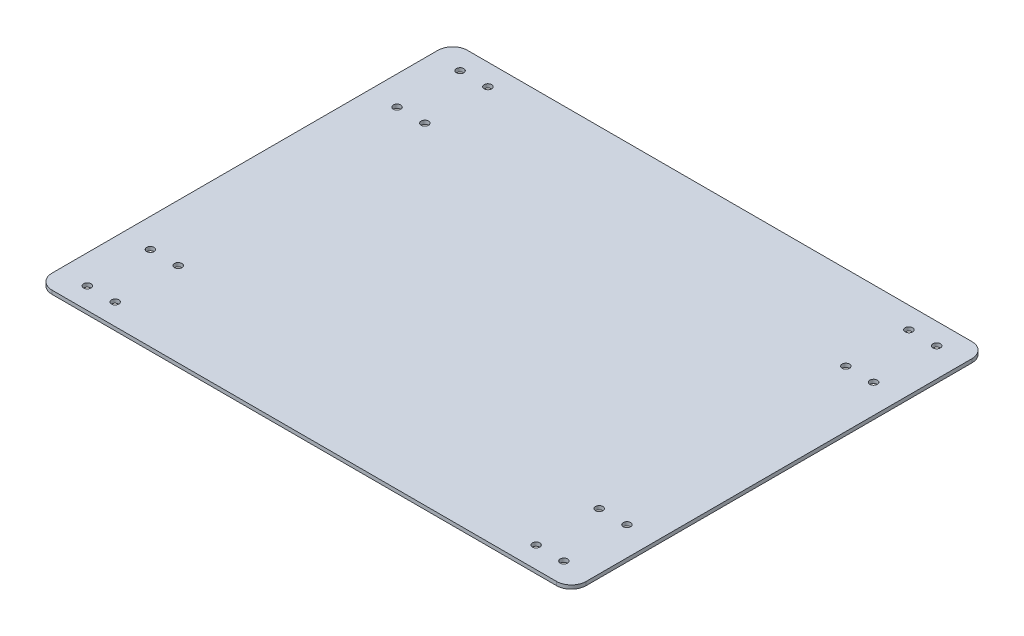
ISO-10303-21;
HEADER;
FILE_DESCRIPTION(('STEP AP214'),'2;1');
FILE_NAME('part.step','',(''),(''),'','','');
FILE_SCHEMA(('AUTOMOTIVE_DESIGN { 1 0 10303 214 1 1 1 1 }'));
ENDSEC;
DATA;
#1=APPLICATION_CONTEXT('core data for automotive mechanical design processes');
#2=APPLICATION_PROTOCOL_DEFINITION('international standard','automotive_design',2000,#1);
#3=PRODUCT_CONTEXT('',#1,'mechanical');
#4=PRODUCT('Part','Part','',(#3));
#5=PRODUCT_RELATED_PRODUCT_CATEGORY('part','',(#4));
#6=PRODUCT_DEFINITION_FORMATION('','',#4);
#7=PRODUCT_DEFINITION_CONTEXT('part definition',#1,'design');
#8=PRODUCT_DEFINITION('design','',#6,#7);
#9=PRODUCT_DEFINITION_SHAPE('','',#8);
#10=(LENGTH_UNIT() NAMED_UNIT(*) SI_UNIT(.MILLI.,.METRE.));
#11=(NAMED_UNIT(*) PLANE_ANGLE_UNIT() SI_UNIT($,.RADIAN.));
#12=(NAMED_UNIT(*) SI_UNIT($,.STERADIAN.) SOLID_ANGLE_UNIT());
#13=UNCERTAINTY_MEASURE_WITH_UNIT(LENGTH_MEASURE(1.E-05),#10,'distance_accuracy_value','');
#14=(GEOMETRIC_REPRESENTATION_CONTEXT(3) GLOBAL_UNCERTAINTY_ASSIGNED_CONTEXT((#13)) GLOBAL_UNIT_ASSIGNED_CONTEXT((#10,
#11,#12)) REPRESENTATION_CONTEXT('',''));
#15=CARTESIAN_POINT('',(0.,0.,0.));
#16=DIRECTION('',(0.,0.,1.));
#17=DIRECTION('',(1.,0.,0.));
#18=AXIS2_PLACEMENT_3D('',#15,#16,#17);
#19=CARTESIAN_POINT('',(-228.6,3.175,177.8));
#20=DIRECTION('',(-1.,0.,0.));
#21=DIRECTION('',(0.,0.,1.));
#22=AXIS2_PLACEMENT_3D('',#19,#20,#21);
#23=PLANE('',#22);
#24=DIRECTION('',(0.,0.,-1.));
#25=VECTOR('',#24,1.);
#26=CARTESIAN_POINT('',(-228.6,3.175,177.8));
#27=LINE('',#26,#25);
#28=CARTESIAN_POINT('',(-228.6,3.175,165.1));
#29=VERTEX_POINT('',#28);
#30=CARTESIAN_POINT('',(-228.6,3.175,-165.1));
#31=VERTEX_POINT('',#30);
#32=EDGE_CURVE('E168',#29,#31,#27,.T.);
#33=ORIENTED_EDGE('',*,*,#32,.T.);
#34=DIRECTION('',(0.,-1.,0.));
#35=VECTOR('',#34,1.);
#36=CARTESIAN_POINT('',(-228.6,3.175,-165.1));
#37=LINE('',#36,#35);
#38=CARTESIAN_POINT('',(-228.6,0.,-165.1));
#39=VERTEX_POINT('',#38);
#40=EDGE_CURVE('E115',#31,#39,#37,.T.);
#41=ORIENTED_EDGE('',*,*,#40,.T.);
#42=DIRECTION('',(0.,0.,-1.));
#43=VECTOR('',#42,1.);
#44=CARTESIAN_POINT('',(-228.6,0.,177.8));
#45=LINE('',#44,#43);
#46=CARTESIAN_POINT('',(-228.6,0.,165.1));
#47=VERTEX_POINT('',#46);
#48=EDGE_CURVE('E107',#47,#39,#45,.T.);
#49=ORIENTED_EDGE('',*,*,#48,.F.);
#50=DIRECTION('',(0.,-1.,0.));
#51=VECTOR('',#50,1.);
#52=CARTESIAN_POINT('',(-228.6,3.175,165.1));
#53=LINE('',#52,#51);
#54=EDGE_CURVE('E120',#47,#29,#53,.F.);
#55=ORIENTED_EDGE('',*,*,#54,.T.);
#56=EDGE_LOOP('',(#33,#41,#49,#55));
#57=FACE_BOUND('',#56,.T.);
#58=ADVANCED_FACE('F38',(#57),#23,.T.);
#59=CARTESIAN_POINT('',(-228.6,3.175,177.8));
#60=DIRECTION('',(0.,0.,-1.));
#61=DIRECTION('',(-1.,0.,0.));
#62=AXIS2_PLACEMENT_3D('',#59,#60,#61);
#63=PLANE('',#62);
#64=DIRECTION('',(1.,0.,0.));
#65=VECTOR('',#64,1.);
#66=CARTESIAN_POINT('',(-228.6,0.,177.8));
#67=LINE('',#66,#65);
#68=CARTESIAN_POINT('',(-215.9,0.,177.8));
#69=VERTEX_POINT('',#68);
#70=CARTESIAN_POINT('',(215.9,0.,177.8));
#71=VERTEX_POINT('',#70);
#72=EDGE_CURVE('E109',#69,#71,#67,.T.);
#73=ORIENTED_EDGE('',*,*,#72,.T.);
#74=DIRECTION('',(0.,-1.,0.));
#75=VECTOR('',#74,1.);
#76=CARTESIAN_POINT('',(215.9,3.175,177.8));
#77=LINE('',#76,#75);
#78=CARTESIAN_POINT('',(215.9,3.175,177.8));
#79=VERTEX_POINT('',#78);
#80=EDGE_CURVE('E11',#71,#79,#77,.F.);
#81=ORIENTED_EDGE('',*,*,#80,.T.);
#82=DIRECTION('',(1.,0.,0.));
#83=VECTOR('',#82,1.);
#84=CARTESIAN_POINT('',(-228.6,3.175,177.8));
#85=LINE('',#84,#83);
#86=CARTESIAN_POINT('',(-215.9,3.175,177.8));
#87=VERTEX_POINT('',#86);
#88=EDGE_CURVE('E128',#87,#79,#85,.T.);
#89=ORIENTED_EDGE('',*,*,#88,.F.);
#90=DIRECTION('',(0.,-1.,0.));
#91=VECTOR('',#90,1.);
#92=CARTESIAN_POINT('',(-215.9,0.,177.8));
#93=LINE('',#92,#91);
#94=EDGE_CURVE('E46',#87,#69,#93,.T.);
#95=ORIENTED_EDGE('',*,*,#94,.T.);
#96=EDGE_LOOP('',(#73,#81,#89,#95));
#97=FACE_BOUND('',#96,.T.);
#98=ADVANCED_FACE('F157',(#97),#63,.F.);
#99=CARTESIAN_POINT('',(228.6,3.175,177.8));
#100=DIRECTION('',(-1.,0.,0.));
#101=DIRECTION('',(0.,0.,1.));
#102=AXIS2_PLACEMENT_3D('',#99,#100,#101);
#103=PLANE('',#102);
#104=DIRECTION('',(0.,0.,-1.));
#105=VECTOR('',#104,1.);
#106=CARTESIAN_POINT('',(228.6,0.,177.8));
#107=LINE('',#106,#105);
#108=CARTESIAN_POINT('',(228.6,0.,165.1));
#109=VERTEX_POINT('',#108);
#110=CARTESIAN_POINT('',(228.6,0.,-165.1));
#111=VERTEX_POINT('',#110);
#112=EDGE_CURVE('E166',#109,#111,#107,.T.);
#113=ORIENTED_EDGE('',*,*,#112,.T.);
#114=DIRECTION('',(0.,-1.,0.));
#115=VECTOR('',#114,1.);
#116=CARTESIAN_POINT('',(228.6,3.175,-165.1));
#117=LINE('',#116,#115);
#118=CARTESIAN_POINT('',(228.6,3.175,-165.1));
#119=VERTEX_POINT('',#118);
#120=EDGE_CURVE('E53',#111,#119,#117,.F.);
#121=ORIENTED_EDGE('',*,*,#120,.T.);
#122=DIRECTION('',(0.,0.,-1.));
#123=VECTOR('',#122,1.);
#124=CARTESIAN_POINT('',(228.6,3.175,177.8));
#125=LINE('',#124,#123);
#126=CARTESIAN_POINT('',(228.6,3.175,165.1));
#127=VERTEX_POINT('',#126);
#128=EDGE_CURVE('E131',#127,#119,#125,.T.);
#129=ORIENTED_EDGE('',*,*,#128,.F.);
#130=DIRECTION('',(0.,-1.,0.));
#131=VECTOR('',#130,1.);
#132=CARTESIAN_POINT('',(228.6,3.175,165.1));
#133=LINE('',#132,#131);
#134=EDGE_CURVE('E152',#127,#109,#133,.T.);
#135=ORIENTED_EDGE('',*,*,#134,.T.);
#136=EDGE_LOOP('',(#113,#121,#129,#135));
#137=FACE_BOUND('',#136,.T.);
#138=ADVANCED_FACE('F165',(#137),#103,.F.);
#139=CARTESIAN_POINT('',(-228.6,3.175,-177.8));
#140=DIRECTION('',(0.,0.,-1.));
#141=DIRECTION('',(-1.,0.,0.));
#142=AXIS2_PLACEMENT_3D('',#139,#140,#141);
#143=PLANE('',#142);
#144=DIRECTION('',(1.,0.,0.));
#145=VECTOR('',#144,1.);
#146=CARTESIAN_POINT('',(-228.6,0.,-177.8));
#147=LINE('',#146,#145);
#148=CARTESIAN_POINT('',(-215.9,0.,-177.8));
#149=VERTEX_POINT('',#148);
#150=CARTESIAN_POINT('',(215.9,0.,-177.8));
#151=VERTEX_POINT('',#150);
#152=EDGE_CURVE('E123',#149,#151,#147,.T.);
#153=ORIENTED_EDGE('',*,*,#152,.F.);
#154=DIRECTION('',(0.,-1.,0.));
#155=VECTOR('',#154,1.);
#156=CARTESIAN_POINT('',(-215.9,3.175,-177.8));
#157=LINE('',#156,#155);
#158=CARTESIAN_POINT('',(-215.9,3.175,-177.8));
#159=VERTEX_POINT('',#158);
#160=EDGE_CURVE('E144',#149,#159,#157,.F.);
#161=ORIENTED_EDGE('',*,*,#160,.T.);
#162=DIRECTION('',(1.,0.,0.));
#163=VECTOR('',#162,1.);
#164=CARTESIAN_POINT('',(-228.6,3.175,-177.8));
#165=LINE('',#164,#163);
#166=CARTESIAN_POINT('',(215.9,3.175,-177.8));
#167=VERTEX_POINT('',#166);
#168=EDGE_CURVE('E172',#159,#167,#165,.T.);
#169=ORIENTED_EDGE('',*,*,#168,.T.);
#170=DIRECTION('',(0.,-1.,0.));
#171=VECTOR('',#170,1.);
#172=CARTESIAN_POINT('',(215.9,0.,-177.8));
#173=LINE('',#172,#171);
#174=EDGE_CURVE('E141',#167,#151,#173,.T.);
#175=ORIENTED_EDGE('',*,*,#174,.T.);
#176=EDGE_LOOP('',(#153,#161,#169,#175));
#177=FACE_BOUND('',#176,.T.);
#178=ADVANCED_FACE('F336',(#177),#143,.T.);
#179=CARTESIAN_POINT('',(0.,3.175,0.));
#180=DIRECTION('',(0.,-1.,0.));
#181=DIRECTION('',(0.,0.,-1.));
#182=AXIS2_PLACEMENT_3D('',#179,#180,#181);
#183=PLANE('',#182);
#184=CARTESIAN_POINT('',(-180.18125,3.175,105.56875));
#185=DIRECTION('',(0.,-1.,0.));
#186=DIRECTION('',(0.,0.,1.));
#187=AXIS2_PLACEMENT_3D('',#184,#185,#186);
#188=CIRCLE('',#187,3.175);
#189=CARTESIAN_POINT('',(-180.18125,3.175,108.74375));
#190=VERTEX_POINT('',#189);
#191=EDGE_CURVE('E251',#190,#190,#188,.T.);
#192=ORIENTED_EDGE('',*,*,#191,.T.);
#193=EDGE_LOOP('',(#192));
#194=FACE_BOUND('',#193,.T.);
#195=CARTESIAN_POINT('',(-203.99375,3.175,159.54375));
#196=DIRECTION('',(0.,-1.,0.));
#197=DIRECTION('',(0.,0.,1.));
#198=AXIS2_PLACEMENT_3D('',#195,#196,#197);
#199=CIRCLE('',#198,3.17499999999997);
#200=CARTESIAN_POINT('',(-203.99375,3.175,162.71875));
#201=VERTEX_POINT('',#200);
#202=EDGE_CURVE('E257',#201,#201,#199,.T.);
#203=ORIENTED_EDGE('',*,*,#202,.T.);
#204=EDGE_LOOP('',(#203));
#205=FACE_BOUND('',#204,.T.);
#206=CARTESIAN_POINT('',(-203.99375,3.175,105.56875));
#207=DIRECTION('',(0.,-1.,0.));
#208=DIRECTION('',(0.,0.,1.));
#209=AXIS2_PLACEMENT_3D('',#206,#207,#208);
#210=CIRCLE('',#209,3.17499999999997);
#211=CARTESIAN_POINT('',(-203.99375,3.175,108.74375));
#212=VERTEX_POINT('',#211);
#213=EDGE_CURVE('E258',#212,#212,#210,.T.);
#214=ORIENTED_EDGE('',*,*,#213,.T.);
#215=EDGE_LOOP('',(#214));
#216=FACE_BOUND('',#215,.T.);
#217=CARTESIAN_POINT('',(-180.18125,3.175,159.54375));
#218=DIRECTION('',(0.,-1.,0.));
#219=DIRECTION('',(0.,0.,1.));
#220=AXIS2_PLACEMENT_3D('',#217,#218,#219);
#221=CIRCLE('',#220,3.175);
#222=CARTESIAN_POINT('',(-180.18125,3.175,162.71875));
#223=VERTEX_POINT('',#222);
#224=EDGE_CURVE('E245',#223,#223,#221,.T.);
#225=ORIENTED_EDGE('',*,*,#224,.T.);
#226=EDGE_LOOP('',(#225));
#227=FACE_BOUND('',#226,.T.);
#228=CARTESIAN_POINT('',(-180.18125,3.175,-105.56875));
#229=DIRECTION('',(0.,1.,0.));
#230=DIRECTION('',(0.,0.,-1.));
#231=AXIS2_PLACEMENT_3D('',#228,#229,#230);
#232=CIRCLE('',#231,3.175);
#233=CARTESIAN_POINT('',(-180.18125,3.175,-108.74375));
#234=VERTEX_POINT('',#233);
#235=EDGE_CURVE('E227',#234,#234,#232,.T.);
#236=ORIENTED_EDGE('',*,*,#235,.F.);
#237=EDGE_LOOP('',(#236));
#238=FACE_BOUND('',#237,.T.);
#239=CARTESIAN_POINT('',(-203.99375,3.175,-159.54375));
#240=DIRECTION('',(0.,1.,0.));
#241=DIRECTION('',(0.,0.,-1.));
#242=AXIS2_PLACEMENT_3D('',#239,#240,#241);
#243=CIRCLE('',#242,3.17499999999997);
#244=CARTESIAN_POINT('',(-203.99375,3.175,-162.71875));
#245=VERTEX_POINT('',#244);
#246=EDGE_CURVE('E233',#245,#245,#243,.T.);
#247=ORIENTED_EDGE('',*,*,#246,.F.);
#248=EDGE_LOOP('',(#247));
#249=FACE_BOUND('',#248,.T.);
#250=CARTESIAN_POINT('',(-203.99375,3.175,-105.56875));
#251=DIRECTION('',(0.,1.,0.));
#252=DIRECTION('',(0.,0.,-1.));
#253=AXIS2_PLACEMENT_3D('',#250,#251,#252);
#254=CIRCLE('',#253,3.17499999999997);
#255=CARTESIAN_POINT('',(-203.99375,3.175,-108.74375));
#256=VERTEX_POINT('',#255);
#257=EDGE_CURVE('E234',#256,#256,#254,.T.);
#258=ORIENTED_EDGE('',*,*,#257,.F.);
#259=EDGE_LOOP('',(#258));
#260=FACE_BOUND('',#259,.T.);
#261=CARTESIAN_POINT('',(-180.18125,3.175,-159.54375));
#262=DIRECTION('',(0.,1.,0.));
#263=DIRECTION('',(0.,0.,-1.));
#264=AXIS2_PLACEMENT_3D('',#261,#262,#263);
#265=CIRCLE('',#264,3.175);
#266=CARTESIAN_POINT('',(-180.18125,3.175,-162.71875));
#267=VERTEX_POINT('',#266);
#268=EDGE_CURVE('E221',#267,#267,#265,.T.);
#269=ORIENTED_EDGE('',*,*,#268,.F.);
#270=EDGE_LOOP('',(#269));
#271=FACE_BOUND('',#270,.T.);
#272=CARTESIAN_POINT('',(180.18125,3.175,105.56875));
#273=DIRECTION('',(0.,1.,0.));
#274=DIRECTION('',(0.,0.,1.));
#275=AXIS2_PLACEMENT_3D('',#272,#273,#274);
#276=CIRCLE('',#275,3.175);
#277=CARTESIAN_POINT('',(180.18125,3.175,108.74375));
#278=VERTEX_POINT('',#277);
#279=EDGE_CURVE('E203',#278,#278,#276,.T.);
#280=ORIENTED_EDGE('',*,*,#279,.F.);
#281=EDGE_LOOP('',(#280));
#282=FACE_BOUND('',#281,.T.);
#283=CARTESIAN_POINT('',(203.99375,3.175,159.54375));
#284=DIRECTION('',(0.,1.,0.));
#285=DIRECTION('',(0.,0.,1.));
#286=AXIS2_PLACEMENT_3D('',#283,#284,#285);
#287=CIRCLE('',#286,3.17499999999997);
#288=CARTESIAN_POINT('',(203.99375,3.175,162.71875));
#289=VERTEX_POINT('',#288);
#290=EDGE_CURVE('E209',#289,#289,#287,.T.);
#291=ORIENTED_EDGE('',*,*,#290,.F.);
#292=EDGE_LOOP('',(#291));
#293=FACE_BOUND('',#292,.T.);
#294=CARTESIAN_POINT('',(203.99375,3.175,105.56875));
#295=DIRECTION('',(0.,1.,0.));
#296=DIRECTION('',(0.,0.,1.));
#297=AXIS2_PLACEMENT_3D('',#294,#295,#296);
#298=CIRCLE('',#297,3.17499999999997);
#299=CARTESIAN_POINT('',(203.99375,3.175,108.74375));
#300=VERTEX_POINT('',#299);
#301=EDGE_CURVE('E210',#300,#300,#298,.T.);
#302=ORIENTED_EDGE('',*,*,#301,.F.);
#303=EDGE_LOOP('',(#302));
#304=FACE_BOUND('',#303,.T.);
#305=CARTESIAN_POINT('',(180.18125,3.175,159.54375));
#306=DIRECTION('',(0.,1.,0.));
#307=DIRECTION('',(0.,0.,1.));
#308=AXIS2_PLACEMENT_3D('',#305,#306,#307);
#309=CIRCLE('',#308,3.175);
#310=CARTESIAN_POINT('',(180.18125,3.175,162.71875));
#311=VERTEX_POINT('',#310);
#312=EDGE_CURVE('E197',#311,#311,#309,.T.);
#313=ORIENTED_EDGE('',*,*,#312,.F.);
#314=EDGE_LOOP('',(#313));
#315=FACE_BOUND('',#314,.T.);
#316=CARTESIAN_POINT('',(180.18125,3.175,-105.56875));
#317=DIRECTION('',(0.,-1.,0.));
#318=DIRECTION('',(0.,0.,-1.));
#319=AXIS2_PLACEMENT_3D('',#316,#317,#318);
#320=CIRCLE('',#319,3.175);
#321=CARTESIAN_POINT('',(180.18125,3.175,-108.74375));
#322=VERTEX_POINT('',#321);
#323=EDGE_CURVE('E179',#322,#322,#320,.T.);
#324=ORIENTED_EDGE('',*,*,#323,.T.);
#325=EDGE_LOOP('',(#324));
#326=FACE_BOUND('',#325,.T.);
#327=CARTESIAN_POINT('',(203.99375,3.175,-159.54375));
#328=DIRECTION('',(0.,-1.,0.));
#329=DIRECTION('',(0.,0.,-1.));
#330=AXIS2_PLACEMENT_3D('',#327,#328,#329);
#331=CIRCLE('',#330,3.17499999999997);
#332=CARTESIAN_POINT('',(203.99375,3.175,-162.71875));
#333=VERTEX_POINT('',#332);
#334=EDGE_CURVE('E185',#333,#333,#331,.T.);
#335=ORIENTED_EDGE('',*,*,#334,.T.);
#336=EDGE_LOOP('',(#335));
#337=FACE_BOUND('',#336,.T.);
#338=CARTESIAN_POINT('',(203.99375,3.175,-105.56875));
#339=DIRECTION('',(0.,-1.,0.));
#340=DIRECTION('',(0.,0.,-1.));
#341=AXIS2_PLACEMENT_3D('',#338,#339,#340);
#342=CIRCLE('',#341,3.17499999999997);
#343=CARTESIAN_POINT('',(203.99375,3.175,-108.74375));
#344=VERTEX_POINT('',#343);
#345=EDGE_CURVE('E186',#344,#344,#342,.T.);
#346=ORIENTED_EDGE('',*,*,#345,.T.);
#347=EDGE_LOOP('',(#346));
#348=FACE_BOUND('',#347,.T.);
#349=CARTESIAN_POINT('',(180.18125,3.175,-159.54375));
#350=DIRECTION('',(0.,-1.,0.));
#351=DIRECTION('',(0.,0.,-1.));
#352=AXIS2_PLACEMENT_3D('',#349,#350,#351);
#353=CIRCLE('',#352,3.175);
#354=CARTESIAN_POINT('',(180.18125,3.175,-162.71875));
#355=VERTEX_POINT('',#354);
#356=EDGE_CURVE('E124',#355,#355,#353,.T.);
#357=ORIENTED_EDGE('',*,*,#356,.T.);
#358=EDGE_LOOP('',(#357));
#359=FACE_BOUND('',#358,.T.);
#360=ORIENTED_EDGE('',*,*,#168,.F.);
#361=CARTESIAN_POINT('',(-215.9,3.175,-165.1));
#362=DIRECTION('',(0.,-1.,0.));
#363=DIRECTION('',(0.,0.,-1.));
#364=AXIS2_PLACEMENT_3D('',#361,#362,#363);
#365=CIRCLE('',#364,12.7);
#366=EDGE_CURVE('E150',#159,#31,#365,.F.);
#367=ORIENTED_EDGE('',*,*,#366,.T.);
#368=ORIENTED_EDGE('',*,*,#32,.F.);
#369=CARTESIAN_POINT('',(-215.9,3.175,165.1));
#370=DIRECTION('',(0.,-1.,0.));
#371=DIRECTION('',(0.,0.,-1.));
#372=AXIS2_PLACEMENT_3D('',#369,#370,#371);
#373=CIRCLE('',#372,12.7);
#374=EDGE_CURVE('E127',#29,#87,#373,.F.);
#375=ORIENTED_EDGE('',*,*,#374,.T.);
#376=ORIENTED_EDGE('',*,*,#88,.T.);
#377=CARTESIAN_POINT('',(215.9,3.175,165.1));
#378=DIRECTION('',(0.,-1.,0.));
#379=DIRECTION('',(0.,0.,-1.));
#380=AXIS2_PLACEMENT_3D('',#377,#378,#379);
#381=CIRCLE('',#380,12.7);
#382=EDGE_CURVE('E60',#79,#127,#381,.F.);
#383=ORIENTED_EDGE('',*,*,#382,.T.);
#384=ORIENTED_EDGE('',*,*,#128,.T.);
#385=CARTESIAN_POINT('',(215.9,3.175,-165.1));
#386=DIRECTION('',(0.,-1.,0.));
#387=DIRECTION('',(0.,0.,-1.));
#388=AXIS2_PLACEMENT_3D('',#385,#386,#387);
#389=CIRCLE('',#388,12.7);
#390=EDGE_CURVE('E148',#119,#167,#389,.F.);
#391=ORIENTED_EDGE('',*,*,#390,.T.);
#392=EDGE_LOOP('',(#360,#367,#368,#375,#376,#383,#384,#391));
#393=FACE_BOUND('',#392,.T.);
#394=ADVANCED_FACE('F160',(#194,#205,#216,#227,#238,#249,#260,#271,#282,#293,#304,#315,#326,
#337,#348,#359,#393),#183,.F.);
#395=CARTESIAN_POINT('',(0.,0.,0.));
#396=DIRECTION('',(0.,-1.,0.));
#397=DIRECTION('',(0.,0.,-1.));
#398=AXIS2_PLACEMENT_3D('',#395,#396,#397);
#399=PLANE('',#398);
#400=CARTESIAN_POINT('',(-180.18125,0.,105.56875));
#401=DIRECTION('',(0.,-1.,0.));
#402=DIRECTION('',(0.,0.,1.));
#403=AXIS2_PLACEMENT_3D('',#400,#401,#402);
#404=CIRCLE('',#403,3.175);
#405=CARTESIAN_POINT('',(-180.18125,0.,108.74375));
#406=VERTEX_POINT('',#405);
#407=EDGE_CURVE('E261',#406,#406,#404,.T.);
#408=ORIENTED_EDGE('',*,*,#407,.F.);
#409=EDGE_LOOP('',(#408));
#410=FACE_BOUND('',#409,.T.);
#411=CARTESIAN_POINT('',(-203.99375,0.,159.54375));
#412=DIRECTION('',(0.,-1.,0.));
#413=DIRECTION('',(0.,0.,1.));
#414=AXIS2_PLACEMENT_3D('',#411,#412,#413);
#415=CIRCLE('',#414,3.17499999999997);
#416=CARTESIAN_POINT('',(-203.99375,0.,162.71875));
#417=VERTEX_POINT('',#416);
#418=EDGE_CURVE('E254',#417,#417,#415,.T.);
#419=ORIENTED_EDGE('',*,*,#418,.F.);
#420=EDGE_LOOP('',(#419));
#421=FACE_BOUND('',#420,.T.);
#422=CARTESIAN_POINT('',(-203.99375,0.,105.56875));
#423=DIRECTION('',(0.,-1.,0.));
#424=DIRECTION('',(0.,0.,1.));
#425=AXIS2_PLACEMENT_3D('',#422,#423,#424);
#426=CIRCLE('',#425,3.17499999999997);
#427=CARTESIAN_POINT('',(-203.99375,0.,108.74375));
#428=VERTEX_POINT('',#427);
#429=EDGE_CURVE('E266',#428,#428,#426,.T.);
#430=ORIENTED_EDGE('',*,*,#429,.F.);
#431=EDGE_LOOP('',(#430));
#432=FACE_BOUND('',#431,.T.);
#433=CARTESIAN_POINT('',(-180.18125,0.,159.54375));
#434=DIRECTION('',(0.,-1.,0.));
#435=DIRECTION('',(0.,0.,1.));
#436=AXIS2_PLACEMENT_3D('',#433,#434,#435);
#437=CIRCLE('',#436,3.175);
#438=CARTESIAN_POINT('',(-180.18125,0.,162.71875));
#439=VERTEX_POINT('',#438);
#440=EDGE_CURVE('E248',#439,#439,#437,.T.);
#441=ORIENTED_EDGE('',*,*,#440,.F.);
#442=EDGE_LOOP('',(#441));
#443=FACE_BOUND('',#442,.T.);
#444=CARTESIAN_POINT('',(-180.18125,0.,-105.56875));
#445=DIRECTION('',(0.,1.,0.));
#446=DIRECTION('',(0.,0.,-1.));
#447=AXIS2_PLACEMENT_3D('',#444,#445,#446);
#448=CIRCLE('',#447,3.175);
#449=CARTESIAN_POINT('',(-180.18125,0.,-108.74375));
#450=VERTEX_POINT('',#449);
#451=EDGE_CURVE('E237',#450,#450,#448,.T.);
#452=ORIENTED_EDGE('',*,*,#451,.T.);
#453=EDGE_LOOP('',(#452));
#454=FACE_BOUND('',#453,.T.);
#455=CARTESIAN_POINT('',(-203.99375,0.,-159.54375));
#456=DIRECTION('',(0.,1.,0.));
#457=DIRECTION('',(0.,0.,-1.));
#458=AXIS2_PLACEMENT_3D('',#455,#456,#457);
#459=CIRCLE('',#458,3.17499999999997);
#460=CARTESIAN_POINT('',(-203.99375,0.,-162.71875));
#461=VERTEX_POINT('',#460);
#462=EDGE_CURVE('E230',#461,#461,#459,.T.);
#463=ORIENTED_EDGE('',*,*,#462,.T.);
#464=EDGE_LOOP('',(#463));
#465=FACE_BOUND('',#464,.T.);
#466=CARTESIAN_POINT('',(-203.99375,0.,-105.56875));
#467=DIRECTION('',(0.,1.,0.));
#468=DIRECTION('',(0.,0.,-1.));
#469=AXIS2_PLACEMENT_3D('',#466,#467,#468);
#470=CIRCLE('',#469,3.17499999999997);
#471=CARTESIAN_POINT('',(-203.99375,0.,-108.74375));
#472=VERTEX_POINT('',#471);
#473=EDGE_CURVE('E242',#472,#472,#470,.T.);
#474=ORIENTED_EDGE('',*,*,#473,.T.);
#475=EDGE_LOOP('',(#474));
#476=FACE_BOUND('',#475,.T.);
#477=CARTESIAN_POINT('',(-180.18125,0.,-159.54375));
#478=DIRECTION('',(0.,1.,0.));
#479=DIRECTION('',(0.,0.,-1.));
#480=AXIS2_PLACEMENT_3D('',#477,#478,#479);
#481=CIRCLE('',#480,3.175);
#482=CARTESIAN_POINT('',(-180.18125,0.,-162.71875));
#483=VERTEX_POINT('',#482);
#484=EDGE_CURVE('E224',#483,#483,#481,.T.);
#485=ORIENTED_EDGE('',*,*,#484,.T.);
#486=EDGE_LOOP('',(#485));
#487=FACE_BOUND('',#486,.T.);
#488=CARTESIAN_POINT('',(180.18125,0.,105.56875));
#489=DIRECTION('',(0.,1.,0.));
#490=DIRECTION('',(0.,0.,1.));
#491=AXIS2_PLACEMENT_3D('',#488,#489,#490);
#492=CIRCLE('',#491,3.175);
#493=CARTESIAN_POINT('',(180.18125,0.,108.74375));
#494=VERTEX_POINT('',#493);
#495=EDGE_CURVE('E213',#494,#494,#492,.T.);
#496=ORIENTED_EDGE('',*,*,#495,.T.);
#497=EDGE_LOOP('',(#496));
#498=FACE_BOUND('',#497,.T.);
#499=CARTESIAN_POINT('',(203.99375,0.,159.54375));
#500=DIRECTION('',(0.,1.,0.));
#501=DIRECTION('',(0.,0.,1.));
#502=AXIS2_PLACEMENT_3D('',#499,#500,#501);
#503=CIRCLE('',#502,3.17499999999997);
#504=CARTESIAN_POINT('',(203.99375,0.,162.71875));
#505=VERTEX_POINT('',#504);
#506=EDGE_CURVE('E206',#505,#505,#503,.T.);
#507=ORIENTED_EDGE('',*,*,#506,.T.);
#508=EDGE_LOOP('',(#507));
#509=FACE_BOUND('',#508,.T.);
#510=CARTESIAN_POINT('',(203.99375,0.,105.56875));
#511=DIRECTION('',(0.,1.,0.));
#512=DIRECTION('',(0.,0.,1.));
#513=AXIS2_PLACEMENT_3D('',#510,#511,#512);
#514=CIRCLE('',#513,3.17499999999997);
#515=CARTESIAN_POINT('',(203.99375,0.,108.74375));
#516=VERTEX_POINT('',#515);
#517=EDGE_CURVE('E218',#516,#516,#514,.T.);
#518=ORIENTED_EDGE('',*,*,#517,.T.);
#519=EDGE_LOOP('',(#518));
#520=FACE_BOUND('',#519,.T.);
#521=CARTESIAN_POINT('',(180.18125,0.,159.54375));
#522=DIRECTION('',(0.,1.,0.));
#523=DIRECTION('',(0.,0.,1.));
#524=AXIS2_PLACEMENT_3D('',#521,#522,#523);
#525=CIRCLE('',#524,3.175);
#526=CARTESIAN_POINT('',(180.18125,0.,162.71875));
#527=VERTEX_POINT('',#526);
#528=EDGE_CURVE('E200',#527,#527,#525,.T.);
#529=ORIENTED_EDGE('',*,*,#528,.T.);
#530=EDGE_LOOP('',(#529));
#531=FACE_BOUND('',#530,.T.);
#532=CARTESIAN_POINT('',(180.18125,0.,-105.56875));
#533=DIRECTION('',(0.,-1.,0.));
#534=DIRECTION('',(0.,0.,-1.));
#535=AXIS2_PLACEMENT_3D('',#532,#533,#534);
#536=CIRCLE('',#535,3.175);
#537=CARTESIAN_POINT('',(180.18125,0.,-108.74375));
#538=VERTEX_POINT('',#537);
#539=EDGE_CURVE('E189',#538,#538,#536,.T.);
#540=ORIENTED_EDGE('',*,*,#539,.F.);
#541=EDGE_LOOP('',(#540));
#542=FACE_BOUND('',#541,.T.);
#543=CARTESIAN_POINT('',(203.99375,0.,-159.54375));
#544=DIRECTION('',(0.,-1.,0.));
#545=DIRECTION('',(0.,0.,-1.));
#546=AXIS2_PLACEMENT_3D('',#543,#544,#545);
#547=CIRCLE('',#546,3.17499999999997);
#548=CARTESIAN_POINT('',(203.99375,0.,-162.71875));
#549=VERTEX_POINT('',#548);
#550=EDGE_CURVE('E182',#549,#549,#547,.T.);
#551=ORIENTED_EDGE('',*,*,#550,.F.);
#552=EDGE_LOOP('',(#551));
#553=FACE_BOUND('',#552,.T.);
#554=CARTESIAN_POINT('',(203.99375,0.,-105.56875));
#555=DIRECTION('',(0.,-1.,0.));
#556=DIRECTION('',(0.,0.,-1.));
#557=AXIS2_PLACEMENT_3D('',#554,#555,#556);
#558=CIRCLE('',#557,3.17499999999997);
#559=CARTESIAN_POINT('',(203.99375,0.,-108.74375));
#560=VERTEX_POINT('',#559);
#561=EDGE_CURVE('E194',#560,#560,#558,.T.);
#562=ORIENTED_EDGE('',*,*,#561,.F.);
#563=EDGE_LOOP('',(#562));
#564=FACE_BOUND('',#563,.T.);
#565=CARTESIAN_POINT('',(180.18125,0.,-159.54375));
#566=DIRECTION('',(0.,-1.,0.));
#567=DIRECTION('',(0.,0.,-1.));
#568=AXIS2_PLACEMENT_3D('',#565,#566,#567);
#569=CIRCLE('',#568,3.175);
#570=CARTESIAN_POINT('',(180.18125,0.,-162.71875));
#571=VERTEX_POINT('',#570);
#572=EDGE_CURVE('E176',#571,#571,#569,.T.);
#573=ORIENTED_EDGE('',*,*,#572,.F.);
#574=EDGE_LOOP('',(#573));
#575=FACE_BOUND('',#574,.T.);
#576=ORIENTED_EDGE('',*,*,#48,.T.);
#577=CARTESIAN_POINT('',(-215.9,0.,-165.1));
#578=DIRECTION('',(0.,-1.,0.));
#579=DIRECTION('',(0.,0.,-1.));
#580=AXIS2_PLACEMENT_3D('',#577,#578,#579);
#581=CIRCLE('',#580,12.7);
#582=EDGE_CURVE('E139',#39,#149,#581,.T.);
#583=ORIENTED_EDGE('',*,*,#582,.T.);
#584=ORIENTED_EDGE('',*,*,#152,.T.);
#585=CARTESIAN_POINT('',(215.9,0.,-165.1));
#586=DIRECTION('',(0.,-1.,0.));
#587=DIRECTION('',(0.,0.,-1.));
#588=AXIS2_PLACEMENT_3D('',#585,#586,#587);
#589=CIRCLE('',#588,12.7);
#590=EDGE_CURVE('E137',#151,#111,#589,.T.);
#591=ORIENTED_EDGE('',*,*,#590,.T.);
#592=ORIENTED_EDGE('',*,*,#112,.F.);
#593=CARTESIAN_POINT('',(215.9,0.,165.1));
#594=DIRECTION('',(0.,-1.,0.));
#595=DIRECTION('',(0.,0.,-1.));
#596=AXIS2_PLACEMENT_3D('',#593,#594,#595);
#597=CIRCLE('',#596,12.7);
#598=EDGE_CURVE('E114',#109,#71,#597,.T.);
#599=ORIENTED_EDGE('',*,*,#598,.T.);
#600=ORIENTED_EDGE('',*,*,#72,.F.);
#601=CARTESIAN_POINT('',(-215.9,0.,165.1));
#602=DIRECTION('',(0.,-1.,0.));
#603=DIRECTION('',(0.,0.,-1.));
#604=AXIS2_PLACEMENT_3D('',#601,#602,#603);
#605=CIRCLE('',#604,12.7);
#606=EDGE_CURVE('E104',#69,#47,#605,.T.);
#607=ORIENTED_EDGE('',*,*,#606,.T.);
#608=EDGE_LOOP('',(#576,#583,#584,#591,#592,#599,#600,#607));
#609=FACE_BOUND('',#608,.T.);
#610=ADVANCED_FACE('F106',(#410,#421,#432,#443,#454,#465,#476,#487,#498,#509,#520,#531,#542,
#553,#564,#575,#609),#399,.T.);
#611=CARTESIAN_POINT('',(-215.9,3.175,-165.1));
#612=DIRECTION('',(0.,-1.,0.));
#613=DIRECTION('',(0.,0.,-1.));
#614=AXIS2_PLACEMENT_3D('',#611,#612,#613);
#615=CYLINDRICAL_SURFACE('',#614,12.7);
#616=ORIENTED_EDGE('',*,*,#366,.F.);
#617=ORIENTED_EDGE('',*,*,#160,.F.);
#618=ORIENTED_EDGE('',*,*,#582,.F.);
#619=ORIENTED_EDGE('',*,*,#40,.F.);
#620=EDGE_LOOP('',(#616,#617,#618,#619));
#621=FACE_BOUND('',#620,.T.);
#622=ADVANCED_FACE('F284',(#621),#615,.T.);
#623=CARTESIAN_POINT('',(215.9,3.175,-165.1));
#624=DIRECTION('',(0.,1.,0.));
#625=DIRECTION('',(0.,0.,1.));
#626=AXIS2_PLACEMENT_3D('',#623,#624,#625);
#627=CYLINDRICAL_SURFACE('',#626,12.7);
#628=ORIENTED_EDGE('',*,*,#390,.F.);
#629=ORIENTED_EDGE('',*,*,#120,.F.);
#630=ORIENTED_EDGE('',*,*,#590,.F.);
#631=ORIENTED_EDGE('',*,*,#174,.F.);
#632=EDGE_LOOP('',(#628,#629,#630,#631));
#633=FACE_BOUND('',#632,.T.);
#634=ADVANCED_FACE('F340',(#633),#627,.T.);
#635=CARTESIAN_POINT('',(215.9,3.175,165.1));
#636=DIRECTION('',(0.,-1.,0.));
#637=DIRECTION('',(0.,0.,-1.));
#638=AXIS2_PLACEMENT_3D('',#635,#636,#637);
#639=CYLINDRICAL_SURFACE('',#638,12.7);
#640=ORIENTED_EDGE('',*,*,#382,.F.);
#641=ORIENTED_EDGE('',*,*,#80,.F.);
#642=ORIENTED_EDGE('',*,*,#598,.F.);
#643=ORIENTED_EDGE('',*,*,#134,.F.);
#644=EDGE_LOOP('',(#640,#641,#642,#643));
#645=FACE_BOUND('',#644,.T.);
#646=ADVANCED_FACE('F163',(#645),#639,.T.);
#647=CARTESIAN_POINT('',(-215.9,3.175,165.1));
#648=DIRECTION('',(0.,1.,0.));
#649=DIRECTION('',(0.,0.,1.));
#650=AXIS2_PLACEMENT_3D('',#647,#648,#649);
#651=CYLINDRICAL_SURFACE('',#650,12.7);
#652=ORIENTED_EDGE('',*,*,#374,.F.);
#653=ORIENTED_EDGE('',*,*,#54,.F.);
#654=ORIENTED_EDGE('',*,*,#606,.F.);
#655=ORIENTED_EDGE('',*,*,#94,.F.);
#656=EDGE_LOOP('',(#652,#653,#654,#655));
#657=FACE_BOUND('',#656,.T.);
#658=ADVANCED_FACE('F40',(#657),#651,.T.);
#659=CARTESIAN_POINT('',(180.18125,3.175,-159.54375));
#660=DIRECTION('',(0.,-1.,0.));
#661=DIRECTION('',(0.,0.,-1.));
#662=AXIS2_PLACEMENT_3D('',#659,#660,#661);
#663=CYLINDRICAL_SURFACE('',#662,3.175);
#664=ORIENTED_EDGE('',*,*,#356,.F.);
#665=EDGE_LOOP('',(#664));
#666=FACE_BOUND('',#665,.T.);
#667=ORIENTED_EDGE('',*,*,#572,.T.);
#668=EDGE_LOOP('',(#667));
#669=FACE_BOUND('',#668,.T.);
#670=ADVANCED_FACE('F313',(#666,#669),#663,.F.);
#671=CARTESIAN_POINT('',(203.99375,3.175,-105.56875));
#672=DIRECTION('',(0.,-1.,0.));
#673=DIRECTION('',(0.,0.,-1.));
#674=AXIS2_PLACEMENT_3D('',#671,#672,#673);
#675=CYLINDRICAL_SURFACE('',#674,3.17499999999997);
#676=ORIENTED_EDGE('',*,*,#345,.F.);
#677=EDGE_LOOP('',(#676));
#678=FACE_BOUND('',#677,.T.);
#679=ORIENTED_EDGE('',*,*,#561,.T.);
#680=EDGE_LOOP('',(#679));
#681=FACE_BOUND('',#680,.T.);
#682=ADVANCED_FACE('F315',(#678,#681),#675,.F.);
#683=CARTESIAN_POINT('',(203.99375,3.175,-159.54375));
#684=DIRECTION('',(0.,-1.,0.));
#685=DIRECTION('',(0.,0.,-1.));
#686=AXIS2_PLACEMENT_3D('',#683,#684,#685);
#687=CYLINDRICAL_SURFACE('',#686,3.17499999999997);
#688=ORIENTED_EDGE('',*,*,#334,.F.);
#689=EDGE_LOOP('',(#688));
#690=FACE_BOUND('',#689,.T.);
#691=ORIENTED_EDGE('',*,*,#550,.T.);
#692=EDGE_LOOP('',(#691));
#693=FACE_BOUND('',#692,.T.);
#694=ADVANCED_FACE('F322',(#690,#693),#687,.F.);
#695=CARTESIAN_POINT('',(180.18125,3.175,-105.56875));
#696=DIRECTION('',(0.,-1.,0.));
#697=DIRECTION('',(0.,0.,-1.));
#698=AXIS2_PLACEMENT_3D('',#695,#696,#697);
#699=CYLINDRICAL_SURFACE('',#698,3.175);
#700=ORIENTED_EDGE('',*,*,#323,.F.);
#701=EDGE_LOOP('',(#700));
#702=FACE_BOUND('',#701,.T.);
#703=ORIENTED_EDGE('',*,*,#539,.T.);
#704=EDGE_LOOP('',(#703));
#705=FACE_BOUND('',#704,.T.);
#706=ADVANCED_FACE('F372',(#702,#705),#699,.F.);
#707=CARTESIAN_POINT('',(180.18125,3.175,159.54375));
#708=DIRECTION('',(0.,-1.,0.));
#709=DIRECTION('',(0.,0.,-1.));
#710=AXIS2_PLACEMENT_3D('',#707,#708,#709);
#711=CYLINDRICAL_SURFACE('',#710,3.175);
#712=ORIENTED_EDGE('',*,*,#312,.T.);
#713=EDGE_LOOP('',(#712));
#714=FACE_BOUND('',#713,.T.);
#715=ORIENTED_EDGE('',*,*,#528,.F.);
#716=EDGE_LOOP('',(#715));
#717=FACE_BOUND('',#716,.T.);
#718=ADVANCED_FACE('F381',(#714,#717),#711,.F.);
#719=CARTESIAN_POINT('',(203.99375,3.175,105.56875));
#720=DIRECTION('',(0.,-1.,0.));
#721=DIRECTION('',(0.,0.,-1.));
#722=AXIS2_PLACEMENT_3D('',#719,#720,#721);
#723=CYLINDRICAL_SURFACE('',#722,3.17499999999997);
#724=ORIENTED_EDGE('',*,*,#301,.T.);
#725=EDGE_LOOP('',(#724));
#726=FACE_BOUND('',#725,.T.);
#727=ORIENTED_EDGE('',*,*,#517,.F.);
#728=EDGE_LOOP('',(#727));
#729=FACE_BOUND('',#728,.T.);
#730=ADVANCED_FACE('F391',(#726,#729),#723,.F.);
#731=CARTESIAN_POINT('',(203.99375,3.175,159.54375));
#732=DIRECTION('',(0.,-1.,0.));
#733=DIRECTION('',(0.,0.,-1.));
#734=AXIS2_PLACEMENT_3D('',#731,#732,#733);
#735=CYLINDRICAL_SURFACE('',#734,3.17499999999997);
#736=ORIENTED_EDGE('',*,*,#290,.T.);
#737=EDGE_LOOP('',(#736));
#738=FACE_BOUND('',#737,.T.);
#739=ORIENTED_EDGE('',*,*,#506,.F.);
#740=EDGE_LOOP('',(#739));
#741=FACE_BOUND('',#740,.T.);
#742=ADVANCED_FACE('F401',(#738,#741),#735,.F.);
#743=CARTESIAN_POINT('',(180.18125,3.175,105.56875));
#744=DIRECTION('',(0.,-1.,0.));
#745=DIRECTION('',(0.,0.,-1.));
#746=AXIS2_PLACEMENT_3D('',#743,#744,#745);
#747=CYLINDRICAL_SURFACE('',#746,3.175);
#748=ORIENTED_EDGE('',*,*,#279,.T.);
#749=EDGE_LOOP('',(#748));
#750=FACE_BOUND('',#749,.T.);
#751=ORIENTED_EDGE('',*,*,#495,.F.);
#752=EDGE_LOOP('',(#751));
#753=FACE_BOUND('',#752,.T.);
#754=ADVANCED_FACE('F411',(#750,#753),#747,.F.);
#755=CARTESIAN_POINT('',(-180.18125,3.175,-159.54375));
#756=DIRECTION('',(0.,-1.,0.));
#757=DIRECTION('',(0.,0.,-1.));
#758=AXIS2_PLACEMENT_3D('',#755,#756,#757);
#759=CYLINDRICAL_SURFACE('',#758,3.175);
#760=ORIENTED_EDGE('',*,*,#268,.T.);
#761=EDGE_LOOP('',(#760));
#762=FACE_BOUND('',#761,.T.);
#763=ORIENTED_EDGE('',*,*,#484,.F.);
#764=EDGE_LOOP('',(#763));
#765=FACE_BOUND('',#764,.T.);
#766=ADVANCED_FACE('F421',(#762,#765),#759,.F.);
#767=CARTESIAN_POINT('',(-203.99375,3.175,-105.56875));
#768=DIRECTION('',(0.,-1.,0.));
#769=DIRECTION('',(0.,0.,-1.));
#770=AXIS2_PLACEMENT_3D('',#767,#768,#769);
#771=CYLINDRICAL_SURFACE('',#770,3.17499999999997);
#772=ORIENTED_EDGE('',*,*,#257,.T.);
#773=EDGE_LOOP('',(#772));
#774=FACE_BOUND('',#773,.T.);
#775=ORIENTED_EDGE('',*,*,#473,.F.);
#776=EDGE_LOOP('',(#775));
#777=FACE_BOUND('',#776,.T.);
#778=ADVANCED_FACE('F442',(#774,#777),#771,.F.);
#779=CARTESIAN_POINT('',(-203.99375,3.175,-159.54375));
#780=DIRECTION('',(0.,-1.,0.));
#781=DIRECTION('',(0.,0.,-1.));
#782=AXIS2_PLACEMENT_3D('',#779,#780,#781);
#783=CYLINDRICAL_SURFACE('',#782,3.17499999999997);
#784=ORIENTED_EDGE('',*,*,#246,.T.);
#785=EDGE_LOOP('',(#784));
#786=FACE_BOUND('',#785,.T.);
#787=ORIENTED_EDGE('',*,*,#462,.F.);
#788=EDGE_LOOP('',(#787));
#789=FACE_BOUND('',#788,.T.);
#790=ADVANCED_FACE('F452',(#786,#789),#783,.F.);
#791=CARTESIAN_POINT('',(-180.18125,3.175,-105.56875));
#792=DIRECTION('',(0.,-1.,0.));
#793=DIRECTION('',(0.,0.,-1.));
#794=AXIS2_PLACEMENT_3D('',#791,#792,#793);
#795=CYLINDRICAL_SURFACE('',#794,3.175);
#796=ORIENTED_EDGE('',*,*,#235,.T.);
#797=EDGE_LOOP('',(#796));
#798=FACE_BOUND('',#797,.T.);
#799=ORIENTED_EDGE('',*,*,#451,.F.);
#800=EDGE_LOOP('',(#799));
#801=FACE_BOUND('',#800,.T.);
#802=ADVANCED_FACE('F462',(#798,#801),#795,.F.);
#803=CARTESIAN_POINT('',(-180.18125,3.175,159.54375));
#804=DIRECTION('',(0.,-1.,0.));
#805=DIRECTION('',(0.,0.,-1.));
#806=AXIS2_PLACEMENT_3D('',#803,#804,#805);
#807=CYLINDRICAL_SURFACE('',#806,3.175);
#808=ORIENTED_EDGE('',*,*,#224,.F.);
#809=EDGE_LOOP('',(#808));
#810=FACE_BOUND('',#809,.T.);
#811=ORIENTED_EDGE('',*,*,#440,.T.);
#812=EDGE_LOOP('',(#811));
#813=FACE_BOUND('',#812,.T.);
#814=ADVANCED_FACE('F278',(#810,#813),#807,.F.);
#815=CARTESIAN_POINT('',(-203.99375,3.175,105.56875));
#816=DIRECTION('',(0.,-1.,0.));
#817=DIRECTION('',(0.,0.,-1.));
#818=AXIS2_PLACEMENT_3D('',#815,#816,#817);
#819=CYLINDRICAL_SURFACE('',#818,3.17499999999997);
#820=ORIENTED_EDGE('',*,*,#213,.F.);
#821=EDGE_LOOP('',(#820));
#822=FACE_BOUND('',#821,.T.);
#823=ORIENTED_EDGE('',*,*,#429,.T.);
#824=EDGE_LOOP('',(#823));
#825=FACE_BOUND('',#824,.T.);
#826=ADVANCED_FACE('F274',(#822,#825),#819,.F.);
#827=CARTESIAN_POINT('',(-203.99375,3.175,159.54375));
#828=DIRECTION('',(0.,-1.,0.));
#829=DIRECTION('',(0.,0.,-1.));
#830=AXIS2_PLACEMENT_3D('',#827,#828,#829);
#831=CYLINDRICAL_SURFACE('',#830,3.17499999999997);
#832=ORIENTED_EDGE('',*,*,#202,.F.);
#833=EDGE_LOOP('',(#832));
#834=FACE_BOUND('',#833,.T.);
#835=ORIENTED_EDGE('',*,*,#418,.T.);
#836=EDGE_LOOP('',(#835));
#837=FACE_BOUND('',#836,.T.);
#838=ADVANCED_FACE('F277',(#834,#837),#831,.F.);
#839=CARTESIAN_POINT('',(-180.18125,3.175,105.56875));
#840=DIRECTION('',(0.,-1.,0.));
#841=DIRECTION('',(0.,0.,-1.));
#842=AXIS2_PLACEMENT_3D('',#839,#840,#841);
#843=CYLINDRICAL_SURFACE('',#842,3.175);
#844=ORIENTED_EDGE('',*,*,#191,.F.);
#845=EDGE_LOOP('',(#844));
#846=FACE_BOUND('',#845,.T.);
#847=ORIENTED_EDGE('',*,*,#407,.T.);
#848=EDGE_LOOP('',(#847));
#849=FACE_BOUND('',#848,.T.);
#850=ADVANCED_FACE('F496',(#846,#849),#843,.F.);
#851=CLOSED_SHELL('',(#58,#98,#138,#178,#394,#610,#622,#634,#646,#658,#670,#682,#694,#706,#718,
#730,#742,#754,#766,#778,#790,#802,#814,#826,#838,#850));
#852=MANIFOLD_SOLID_BREP('B2',#851);
#853=ADVANCED_BREP_SHAPE_REPRESENTATION('',(#18,#852),#14);
#854=SHAPE_DEFINITION_REPRESENTATION(#9,#853);
ENDSEC;
END-ISO-10303-21;
